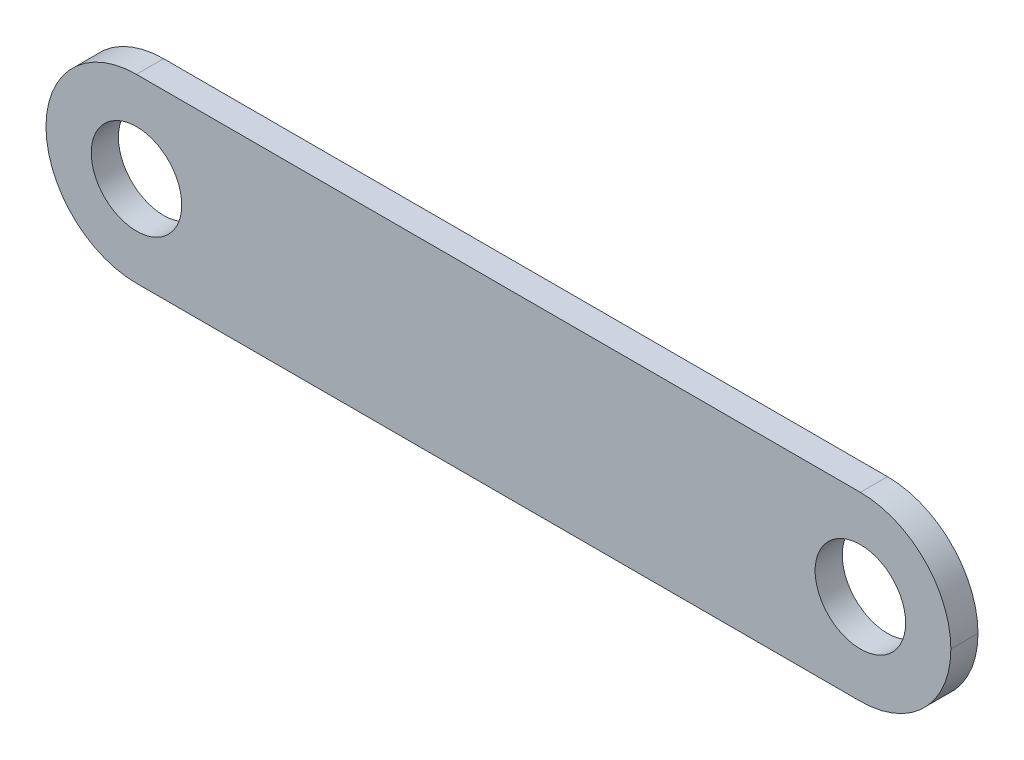
ISO-10303-21;
HEADER;
FILE_DESCRIPTION(('STEP AP214'),'2;1');
FILE_NAME('part.step','',(''),(''),'','','');
FILE_SCHEMA(('AUTOMOTIVE_DESIGN { 1 0 10303 214 1 1 1 1 }'));
ENDSEC;
DATA;
#1=APPLICATION_CONTEXT('core data for automotive mechanical design processes');
#2=APPLICATION_PROTOCOL_DEFINITION('international standard','automotive_design',2000,#1);
#3=PRODUCT_CONTEXT('',#1,'mechanical');
#4=PRODUCT('Part','Part','',(#3));
#5=PRODUCT_RELATED_PRODUCT_CATEGORY('part','',(#4));
#6=PRODUCT_DEFINITION_FORMATION('','',#4);
#7=PRODUCT_DEFINITION_CONTEXT('part definition',#1,'design');
#8=PRODUCT_DEFINITION('design','',#6,#7);
#9=PRODUCT_DEFINITION_SHAPE('','',#8);
#10=(LENGTH_UNIT() NAMED_UNIT(*) SI_UNIT(.MILLI.,.METRE.));
#11=(NAMED_UNIT(*) PLANE_ANGLE_UNIT() SI_UNIT($,.RADIAN.));
#12=(NAMED_UNIT(*) SI_UNIT($,.STERADIAN.) SOLID_ANGLE_UNIT());
#13=UNCERTAINTY_MEASURE_WITH_UNIT(LENGTH_MEASURE(1.E-05),#10,'distance_accuracy_value','');
#14=(GEOMETRIC_REPRESENTATION_CONTEXT(3) GLOBAL_UNCERTAINTY_ASSIGNED_CONTEXT((#13)) GLOBAL_UNIT_ASSIGNED_CONTEXT((#10,
#11,#12)) REPRESENTATION_CONTEXT('',''));
#15=CARTESIAN_POINT('',(0.,0.,0.));
#16=DIRECTION('',(0.,0.,1.));
#17=DIRECTION('',(1.,0.,0.));
#18=AXIS2_PLACEMENT_3D('',#15,#16,#17);
#19=CARTESIAN_POINT('',(0.,0.,3.));
#20=DIRECTION('',(0.,1.,0.));
#21=DIRECTION('',(0.,0.,1.));
#22=AXIS2_PLACEMENT_3D('',#19,#20,#21);
#23=PLANE('',#22);
#24=DIRECTION('',(1.,0.,0.));
#25=VECTOR('',#24,1.);
#26=CARTESIAN_POINT('',(0.,0.,0.));
#27=LINE('',#26,#25);
#28=CARTESIAN_POINT('',(10.,0.,0.));
#29=VERTEX_POINT('',#28);
#30=CARTESIAN_POINT('',(90.,0.,0.));
#31=VERTEX_POINT('',#30);
#32=EDGE_CURVE('E92',#29,#31,#27,.T.);
#33=ORIENTED_EDGE('',*,*,#32,.T.);
#34=DIRECTION('',(0.,0.,-1.));
#35=VECTOR('',#34,1.);
#36=CARTESIAN_POINT('',(90.,0.,3.));
#37=LINE('',#36,#35);
#38=CARTESIAN_POINT('',(90.,0.,3.));
#39=VERTEX_POINT('',#38);
#40=EDGE_CURVE('E123',#31,#39,#37,.F.);
#41=ORIENTED_EDGE('',*,*,#40,.T.);
#42=DIRECTION('',(1.,0.,0.));
#43=VECTOR('',#42,1.);
#44=CARTESIAN_POINT('',(0.,0.,3.));
#45=LINE('',#44,#43);
#46=CARTESIAN_POINT('',(10.,0.,3.));
#47=VERTEX_POINT('',#46);
#48=EDGE_CURVE('E133',#47,#39,#45,.T.);
#49=ORIENTED_EDGE('',*,*,#48,.F.);
#50=DIRECTION('',(0.,0.,-1.));
#51=VECTOR('',#50,1.);
#52=CARTESIAN_POINT('',(10.,0.,3.));
#53=LINE('',#52,#51);
#54=EDGE_CURVE('E126',#47,#29,#53,.T.);
#55=ORIENTED_EDGE('',*,*,#54,.T.);
#56=EDGE_LOOP('',(#33,#41,#49,#55));
#57=FACE_BOUND('',#56,.T.);
#58=ADVANCED_FACE('F33',(#57),#23,.F.);
#59=CARTESIAN_POINT('',(0.,20.,3.));
#60=DIRECTION('',(0.,-1.,0.));
#61=DIRECTION('',(0.,0.,-1.));
#62=AXIS2_PLACEMENT_3D('',#59,#60,#61);
#63=PLANE('',#62);
#64=DIRECTION('',(-1.,0.,0.));
#65=VECTOR('',#64,1.);
#66=CARTESIAN_POINT('',(0.,20.,3.));
#67=LINE('',#66,#65);
#68=CARTESIAN_POINT('',(90.,20.,3.));
#69=VERTEX_POINT('',#68);
#70=CARTESIAN_POINT('',(10.,20.,3.));
#71=VERTEX_POINT('',#70);
#72=EDGE_CURVE('E104',#69,#71,#67,.T.);
#73=ORIENTED_EDGE('',*,*,#72,.F.);
#74=DIRECTION('',(0.,0.,-1.));
#75=VECTOR('',#74,1.);
#76=CARTESIAN_POINT('',(90.,20.,3.));
#77=LINE('',#76,#75);
#78=CARTESIAN_POINT('',(90.,20.,0.));
#79=VERTEX_POINT('',#78);
#80=EDGE_CURVE('E11',#69,#79,#77,.T.);
#81=ORIENTED_EDGE('',*,*,#80,.T.);
#82=DIRECTION('',(-1.,0.,0.));
#83=VECTOR('',#82,1.);
#84=CARTESIAN_POINT('',(0.,20.,0.));
#85=LINE('',#84,#83);
#86=CARTESIAN_POINT('',(10.,20.,0.));
#87=VERTEX_POINT('',#86);
#88=EDGE_CURVE('E131',#79,#87,#85,.T.);
#89=ORIENTED_EDGE('',*,*,#88,.T.);
#90=DIRECTION('',(0.,0.,-1.));
#91=VECTOR('',#90,1.);
#92=CARTESIAN_POINT('',(10.,20.,3.));
#93=LINE('',#92,#91);
#94=EDGE_CURVE('E42',#87,#71,#93,.F.);
#95=ORIENTED_EDGE('',*,*,#94,.T.);
#96=EDGE_LOOP('',(#73,#81,#89,#95));
#97=FACE_BOUND('',#96,.T.);
#98=ADVANCED_FACE('F163',(#97),#63,.F.);
#99=CARTESIAN_POINT('',(0.,0.,3.));
#100=DIRECTION('',(0.,0.,-1.));
#101=DIRECTION('',(-1.,0.,0.));
#102=AXIS2_PLACEMENT_3D('',#99,#100,#101);
#103=PLANE('',#102);
#104=CARTESIAN_POINT('',(90.,10.,3.));
#105=DIRECTION('',(0.,0.,1.));
#106=DIRECTION('',(1.,0.,0.));
#107=AXIS2_PLACEMENT_3D('',#104,#105,#106);
#108=CIRCLE('',#107,4.99999999999999);
#109=CARTESIAN_POINT('',(95.,10.,3.));
#110=VERTEX_POINT('',#109);
#111=EDGE_CURVE('E140',#110,#110,#108,.T.);
#112=ORIENTED_EDGE('',*,*,#111,.F.);
#113=EDGE_LOOP('',(#112));
#114=FACE_BOUND('',#113,.T.);
#115=CARTESIAN_POINT('',(10.,10.,3.));
#116=DIRECTION('',(0.,0.,1.));
#117=DIRECTION('',(1.,0.,0.));
#118=AXIS2_PLACEMENT_3D('',#115,#116,#117);
#119=CIRCLE('',#118,5.);
#120=CARTESIAN_POINT('',(15.,10.,3.));
#121=VERTEX_POINT('',#120);
#122=EDGE_CURVE('E114',#121,#121,#119,.T.);
#123=ORIENTED_EDGE('',*,*,#122,.F.);
#124=EDGE_LOOP('',(#123));
#125=FACE_BOUND('',#124,.T.);
#126=ORIENTED_EDGE('',*,*,#48,.T.);
#127=CARTESIAN_POINT('',(90.,10.,3.));
#128=DIRECTION('',(0.,0.,-1.));
#129=DIRECTION('',(-1.,0.,0.));
#130=AXIS2_PLACEMENT_3D('',#127,#128,#129);
#131=CIRCLE('',#130,10.);
#132=CARTESIAN_POINT('',(100.,10.,3.));
#133=VERTEX_POINT('',#132);
#134=EDGE_CURVE('E117',#39,#133,#131,.F.);
#135=ORIENTED_EDGE('',*,*,#134,.T.);
#136=CARTESIAN_POINT('',(90.,10.,3.));
#137=DIRECTION('',(0.,0.,-1.));
#138=DIRECTION('',(-1.,0.,0.));
#139=AXIS2_PLACEMENT_3D('',#136,#137,#138);
#140=CIRCLE('',#139,10.);
#141=EDGE_CURVE('E56',#133,#69,#140,.F.);
#142=ORIENTED_EDGE('',*,*,#141,.T.);
#143=ORIENTED_EDGE('',*,*,#72,.T.);
#144=CARTESIAN_POINT('',(10.,10.,3.));
#145=DIRECTION('',(0.,0.,-1.));
#146=DIRECTION('',(-1.,0.,0.));
#147=AXIS2_PLACEMENT_3D('',#144,#145,#146);
#148=CIRCLE('',#147,10.);
#149=CARTESIAN_POINT('',(0.,10.,3.));
#150=VERTEX_POINT('',#149);
#151=EDGE_CURVE('E121',#71,#150,#148,.F.);
#152=ORIENTED_EDGE('',*,*,#151,.T.);
#153=CARTESIAN_POINT('',(10.,10.,3.));
#154=DIRECTION('',(0.,0.,-1.));
#155=DIRECTION('',(-1.,0.,0.));
#156=AXIS2_PLACEMENT_3D('',#153,#154,#155);
#157=CIRCLE('',#156,10.);
#158=EDGE_CURVE('E107',#150,#47,#157,.F.);
#159=ORIENTED_EDGE('',*,*,#158,.T.);
#160=EDGE_LOOP('',(#126,#135,#142,#143,#152,#159));
#161=FACE_BOUND('',#160,.T.);
#162=ADVANCED_FACE('F152',(#114,#125,#161),#103,.F.);
#163=CARTESIAN_POINT('',(0.,0.,0.));
#164=DIRECTION('',(0.,0.,-1.));
#165=DIRECTION('',(-1.,0.,0.));
#166=AXIS2_PLACEMENT_3D('',#163,#164,#165);
#167=PLANE('',#166);
#168=CARTESIAN_POINT('',(90.,10.,0.));
#169=DIRECTION('',(0.,0.,-1.));
#170=DIRECTION('',(-1.,0.,0.));
#171=AXIS2_PLACEMENT_3D('',#168,#169,#170);
#172=CIRCLE('',#171,4.99999999999999);
#173=CARTESIAN_POINT('',(85.,10.,0.));
#174=VERTEX_POINT('',#173);
#175=EDGE_CURVE('E37',#174,#174,#172,.T.);
#176=ORIENTED_EDGE('',*,*,#175,.F.);
#177=EDGE_LOOP('',(#176));
#178=FACE_BOUND('',#177,.T.);
#179=CARTESIAN_POINT('',(10.,10.,0.));
#180=DIRECTION('',(0.,0.,-1.));
#181=DIRECTION('',(-1.,0.,0.));
#182=AXIS2_PLACEMENT_3D('',#179,#180,#181);
#183=CIRCLE('',#182,5.);
#184=CARTESIAN_POINT('',(5.,10.,0.));
#185=VERTEX_POINT('',#184);
#186=EDGE_CURVE('E109',#185,#185,#183,.T.);
#187=ORIENTED_EDGE('',*,*,#186,.F.);
#188=EDGE_LOOP('',(#187));
#189=FACE_BOUND('',#188,.T.);
#190=CARTESIAN_POINT('',(90.,10.,0.));
#191=DIRECTION('',(0.,0.,-1.));
#192=DIRECTION('',(-1.,0.,0.));
#193=AXIS2_PLACEMENT_3D('',#190,#191,#192);
#194=CIRCLE('',#193,10.);
#195=CARTESIAN_POINT('',(100.,10.,0.));
#196=VERTEX_POINT('',#195);
#197=EDGE_CURVE('E97',#79,#196,#194,.T.);
#198=ORIENTED_EDGE('',*,*,#197,.T.);
#199=CARTESIAN_POINT('',(90.,10.,0.));
#200=DIRECTION('',(0.,0.,-1.));
#201=DIRECTION('',(-1.,0.,0.));
#202=AXIS2_PLACEMENT_3D('',#199,#200,#201);
#203=CIRCLE('',#202,10.);
#204=EDGE_CURVE('E128',#196,#31,#203,.T.);
#205=ORIENTED_EDGE('',*,*,#204,.T.);
#206=ORIENTED_EDGE('',*,*,#32,.F.);
#207=CARTESIAN_POINT('',(10.,10.,0.));
#208=DIRECTION('',(0.,0.,-1.));
#209=DIRECTION('',(-1.,0.,0.));
#210=AXIS2_PLACEMENT_3D('',#207,#208,#209);
#211=CIRCLE('',#210,10.);
#212=CARTESIAN_POINT('',(0.,10.,0.));
#213=VERTEX_POINT('',#212);
#214=EDGE_CURVE('E86',#29,#213,#211,.T.);
#215=ORIENTED_EDGE('',*,*,#214,.T.);
#216=CARTESIAN_POINT('',(10.,10.,0.));
#217=DIRECTION('',(0.,0.,-1.));
#218=DIRECTION('',(-1.,0.,0.));
#219=AXIS2_PLACEMENT_3D('',#216,#217,#218);
#220=CIRCLE('',#219,10.);
#221=EDGE_CURVE('E90',#213,#87,#220,.T.);
#222=ORIENTED_EDGE('',*,*,#221,.T.);
#223=ORIENTED_EDGE('',*,*,#88,.F.);
#224=EDGE_LOOP('',(#198,#205,#206,#215,#222,#223));
#225=FACE_BOUND('',#224,.T.);
#226=ADVANCED_FACE('F88',(#178,#189,#225),#167,.T.);
#227=CARTESIAN_POINT('',(90.,10.,3.));
#228=DIRECTION('',(0.,0.,-1.));
#229=DIRECTION('',(-1.,0.,0.));
#230=AXIS2_PLACEMENT_3D('',#227,#228,#229);
#231=CYLINDRICAL_SURFACE('',#230,10.);
#232=ORIENTED_EDGE('',*,*,#80,.F.);
#233=ORIENTED_EDGE('',*,*,#141,.F.);
#234=DIRECTION('',(0.,0.,-1.));
#235=VECTOR('',#234,1.);
#236=CARTESIAN_POINT('',(100.,10.,3.));
#237=LINE('',#236,#235);
#238=EDGE_CURVE('E108',#196,#133,#237,.F.);
#239=ORIENTED_EDGE('',*,*,#238,.F.);
#240=ORIENTED_EDGE('',*,*,#197,.F.);
#241=EDGE_LOOP('',(#232,#233,#239,#240));
#242=FACE_BOUND('',#241,.T.);
#243=ADVANCED_FACE('F151',(#242),#231,.T.);
#244=CARTESIAN_POINT('',(90.,10.,3.));
#245=DIRECTION('',(0.,0.,-1.));
#246=DIRECTION('',(-1.,0.,0.));
#247=AXIS2_PLACEMENT_3D('',#244,#245,#246);
#248=CYLINDRICAL_SURFACE('',#247,10.);
#249=ORIENTED_EDGE('',*,*,#134,.F.);
#250=ORIENTED_EDGE('',*,*,#40,.F.);
#251=ORIENTED_EDGE('',*,*,#204,.F.);
#252=ORIENTED_EDGE('',*,*,#238,.T.);
#253=EDGE_LOOP('',(#249,#250,#251,#252));
#254=FACE_BOUND('',#253,.T.);
#255=ADVANCED_FACE('F171',(#254),#248,.T.);
#256=CARTESIAN_POINT('',(10.,10.,3.));
#257=DIRECTION('',(0.,0.,-1.));
#258=DIRECTION('',(-1.,0.,0.));
#259=AXIS2_PLACEMENT_3D('',#256,#257,#258);
#260=CYLINDRICAL_SURFACE('',#259,10.);
#261=DIRECTION('',(0.,0.,-1.));
#262=VECTOR('',#261,1.);
#263=CARTESIAN_POINT('',(0.,10.,3.));
#264=LINE('',#263,#262);
#265=EDGE_CURVE('E102',#150,#213,#264,.T.);
#266=ORIENTED_EDGE('',*,*,#265,.F.);
#267=ORIENTED_EDGE('',*,*,#151,.F.);
#268=ORIENTED_EDGE('',*,*,#94,.F.);
#269=ORIENTED_EDGE('',*,*,#221,.F.);
#270=EDGE_LOOP('',(#266,#267,#268,#269));
#271=FACE_BOUND('',#270,.T.);
#272=ADVANCED_FACE('F35',(#271),#260,.T.);
#273=CARTESIAN_POINT('',(10.,10.,3.));
#274=DIRECTION('',(0.,0.,-1.));
#275=DIRECTION('',(-1.,0.,0.));
#276=AXIS2_PLACEMENT_3D('',#273,#274,#275);
#277=CYLINDRICAL_SURFACE('',#276,10.);
#278=ORIENTED_EDGE('',*,*,#158,.F.);
#279=ORIENTED_EDGE('',*,*,#265,.T.);
#280=ORIENTED_EDGE('',*,*,#214,.F.);
#281=ORIENTED_EDGE('',*,*,#54,.F.);
#282=EDGE_LOOP('',(#278,#279,#280,#281));
#283=FACE_BOUND('',#282,.T.);
#284=ADVANCED_FACE('F106',(#283),#277,.T.);
#285=CARTESIAN_POINT('',(10.,10.,-7.));
#286=DIRECTION('',(0.,0.,1.));
#287=DIRECTION('',(1.,0.,0.));
#288=AXIS2_PLACEMENT_3D('',#285,#286,#287);
#289=CYLINDRICAL_SURFACE('',#288,5.);
#290=ORIENTED_EDGE('',*,*,#186,.T.);
#291=EDGE_LOOP('',(#290));
#292=FACE_BOUND('',#291,.T.);
#293=ORIENTED_EDGE('',*,*,#122,.T.);
#294=EDGE_LOOP('',(#293));
#295=FACE_BOUND('',#294,.T.);
#296=ADVANCED_FACE('F156',(#292,#295),#289,.F.);
#297=CARTESIAN_POINT('',(90.,10.,-7.));
#298=DIRECTION('',(0.,0.,1.));
#299=DIRECTION('',(1.,0.,0.));
#300=AXIS2_PLACEMENT_3D('',#297,#298,#299);
#301=CYLINDRICAL_SURFACE('',#300,4.99999999999999);
#302=ORIENTED_EDGE('',*,*,#175,.T.);
#303=EDGE_LOOP('',(#302));
#304=FACE_BOUND('',#303,.T.);
#305=ORIENTED_EDGE('',*,*,#111,.T.);
#306=EDGE_LOOP('',(#305));
#307=FACE_BOUND('',#306,.T.);
#308=ADVANCED_FACE('F147',(#304,#307),#301,.F.);
#309=CLOSED_SHELL('',(#58,#98,#162,#226,#243,#255,#272,#284,#296,#308));
#310=MANIFOLD_SOLID_BREP('B2',#309);
#311=ADVANCED_BREP_SHAPE_REPRESENTATION('',(#18,#310),#14);
#312=SHAPE_DEFINITION_REPRESENTATION(#9,#311);
ENDSEC;
END-ISO-10303-21;
